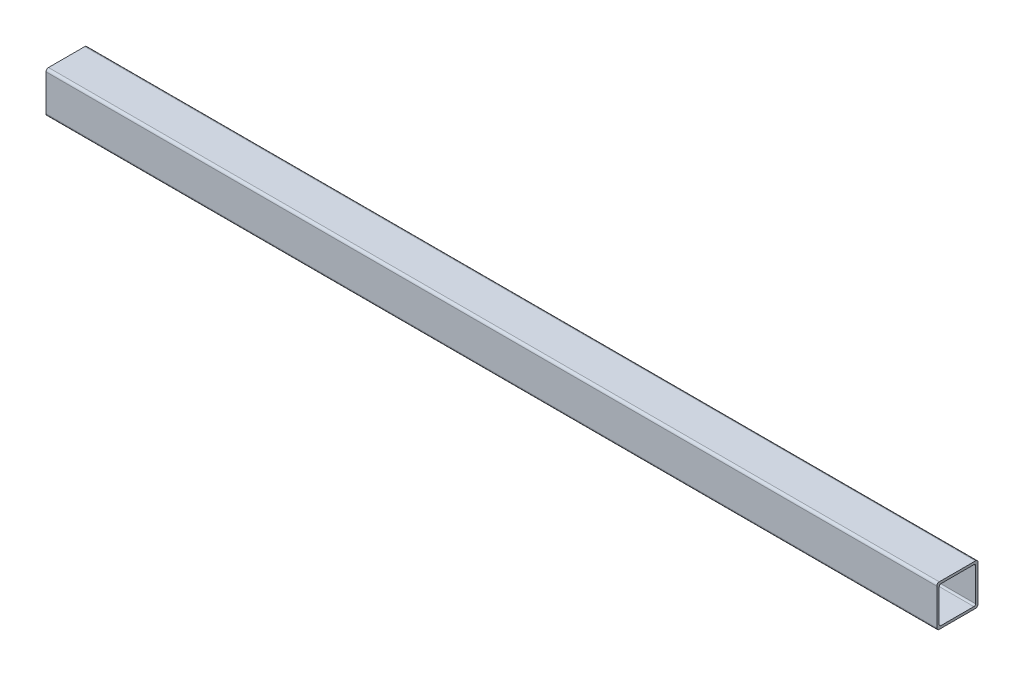
ISO-10303-21;
HEADER;
FILE_DESCRIPTION(('STEP AP214'),'2;1');
FILE_NAME('part.step','',(''),(''),'','','');
FILE_SCHEMA(('AUTOMOTIVE_DESIGN { 1 0 10303 214 1 1 1 1 }'));
ENDSEC;
DATA;
#1=APPLICATION_CONTEXT('core data for automotive mechanical design processes');
#2=APPLICATION_PROTOCOL_DEFINITION('international standard','automotive_design',2000,#1);
#3=PRODUCT_CONTEXT('',#1,'mechanical');
#4=PRODUCT('Part','Part','',(#3));
#5=PRODUCT_RELATED_PRODUCT_CATEGORY('part','',(#4));
#6=PRODUCT_DEFINITION_FORMATION('','',#4);
#7=PRODUCT_DEFINITION_CONTEXT('part definition',#1,'design');
#8=PRODUCT_DEFINITION('design','',#6,#7);
#9=PRODUCT_DEFINITION_SHAPE('','',#8);
#10=(LENGTH_UNIT() NAMED_UNIT(*) SI_UNIT(.MILLI.,.METRE.));
#11=(NAMED_UNIT(*) PLANE_ANGLE_UNIT() SI_UNIT($,.RADIAN.));
#12=(NAMED_UNIT(*) SI_UNIT($,.STERADIAN.) SOLID_ANGLE_UNIT());
#13=UNCERTAINTY_MEASURE_WITH_UNIT(LENGTH_MEASURE(1.E-05),#10,'distance_accuracy_value','');
#14=(GEOMETRIC_REPRESENTATION_CONTEXT(3) GLOBAL_UNCERTAINTY_ASSIGNED_CONTEXT((#13)) GLOBAL_UNIT_ASSIGNED_CONTEXT((#10,
#11,#12)) REPRESENTATION_CONTEXT('',''));
#15=CARTESIAN_POINT('',(0.,0.,0.));
#16=DIRECTION('',(0.,0.,1.));
#17=DIRECTION('',(1.,0.,0.));
#18=AXIS2_PLACEMENT_3D('',#15,#16,#17);
#19=CARTESIAN_POINT('',(-1150.71067811867,-50.,47.));
#20=DIRECTION('',(0.,-1.,0.));
#21=DIRECTION('',(0.,0.,-1.));
#22=AXIS2_PLACEMENT_3D('',#19,#20,#21);
#23=PLANE('',#22);
#24=DIRECTION('',(0.,0.,1.));
#25=VECTOR('',#24,1.);
#26=CARTESIAN_POINT('',(-1080.00000000001,-50.,47.));
#27=LINE('',#26,#25);
#28=CARTESIAN_POINT('',(-1080.00000000001,-50.,3.));
#29=VERTEX_POINT('',#28);
#30=CARTESIAN_POINT('',(-1080.00000000001,-50.,47.));
#31=VERTEX_POINT('',#30);
#32=EDGE_CURVE('E11',#29,#31,#27,.T.);
#33=ORIENTED_EDGE('',*,*,#32,.F.);
#34=DIRECTION('',(1.,0.,0.));
#35=VECTOR('',#34,1.);
#36=CARTESIAN_POINT('',(-1150.71067811867,-50.,3.));
#37=LINE('',#36,#35);
#38=CARTESIAN_POINT('',(0.,-50.,3.));
#39=VERTEX_POINT('',#38);
#40=EDGE_CURVE('E233',#29,#39,#37,.T.);
#41=ORIENTED_EDGE('',*,*,#40,.T.);
#42=DIRECTION('',(0.,0.,-1.));
#43=VECTOR('',#42,1.);
#44=CARTESIAN_POINT('',(0.,-50.,47.));
#45=LINE('',#44,#43);
#46=CARTESIAN_POINT('',(0.,-50.,47.));
#47=VERTEX_POINT('',#46);
#48=EDGE_CURVE('E199',#47,#39,#45,.T.);
#49=ORIENTED_EDGE('',*,*,#48,.F.);
#50=DIRECTION('',(1.,0.,0.));
#51=VECTOR('',#50,1.);
#52=CARTESIAN_POINT('',(-1150.71067811867,-50.,47.));
#53=LINE('',#52,#51);
#54=EDGE_CURVE('E220',#31,#47,#53,.T.);
#55=ORIENTED_EDGE('',*,*,#54,.F.);
#56=EDGE_LOOP('',(#33,#41,#49,#55));
#57=FACE_BOUND('',#56,.T.);
#58=ADVANCED_FACE('F34',(#57),#23,.T.);
#59=CARTESIAN_POINT('',(-1150.71067811867,-47.,3.00000000000001));
#60=DIRECTION('',(1.,0.,0.));
#61=DIRECTION('',(0.,0.,-1.));
#62=AXIS2_PLACEMENT_3D('',#59,#60,#61);
#63=CYLINDRICAL_SURFACE('',#62,3.);
#64=CARTESIAN_POINT('',(-1080.00000000001,-47.,3.00000000000001));
#65=DIRECTION('',(1.,0.,0.));
#66=DIRECTION('',(0.,0.,-1.));
#67=AXIS2_PLACEMENT_3D('',#64,#65,#66);
#68=CIRCLE('',#67,3.);
#69=CARTESIAN_POINT('',(-1080.00000000001,-47.,0.));
#70=VERTEX_POINT('',#69);
#71=EDGE_CURVE('E300',#70,#29,#68,.F.);
#72=ORIENTED_EDGE('',*,*,#71,.F.);
#73=DIRECTION('',(1.,0.,0.));
#74=VECTOR('',#73,1.);
#75=CARTESIAN_POINT('',(-1150.71067811867,-47.,0.));
#76=LINE('',#75,#74);
#77=CARTESIAN_POINT('',(0.,-47.,0.));
#78=VERTEX_POINT('',#77);
#79=EDGE_CURVE('E231',#70,#78,#76,.T.);
#80=ORIENTED_EDGE('',*,*,#79,.T.);
#81=CARTESIAN_POINT('',(0.,-47.,3.00000000000001));
#82=DIRECTION('',(1.,0.,0.));
#83=DIRECTION('',(0.,0.,-1.));
#84=AXIS2_PLACEMENT_3D('',#81,#82,#83);
#85=CIRCLE('',#84,3.);
#86=EDGE_CURVE('E202',#39,#78,#85,.T.);
#87=ORIENTED_EDGE('',*,*,#86,.F.);
#88=ORIENTED_EDGE('',*,*,#40,.F.);
#89=EDGE_LOOP('',(#72,#80,#87,#88));
#90=FACE_BOUND('',#89,.T.);
#91=ADVANCED_FACE('F324',(#90),#63,.T.);
#92=CARTESIAN_POINT('',(-1150.71067811867,-2.99999999999999,0.));
#93=DIRECTION('',(0.,0.,-1.));
#94=DIRECTION('',(-1.,0.,0.));
#95=AXIS2_PLACEMENT_3D('',#92,#93,#94);
#96=PLANE('',#95);
#97=DIRECTION('',(0.,-1.,0.));
#98=VECTOR('',#97,1.);
#99=CARTESIAN_POINT('',(-1080.00000000001,-2.99999999999999,0.));
#100=LINE('',#99,#98);
#101=CARTESIAN_POINT('',(-1080.00000000001,-2.99999999999999,0.));
#102=VERTEX_POINT('',#101);
#103=EDGE_CURVE('E302',#102,#70,#100,.T.);
#104=ORIENTED_EDGE('',*,*,#103,.F.);
#105=DIRECTION('',(1.,0.,0.));
#106=VECTOR('',#105,1.);
#107=CARTESIAN_POINT('',(-1150.71067811867,-2.99999999999999,0.));
#108=LINE('',#107,#106);
#109=CARTESIAN_POINT('',(0.,-2.99999999999999,0.));
#110=VERTEX_POINT('',#109);
#111=EDGE_CURVE('E229',#102,#110,#108,.T.);
#112=ORIENTED_EDGE('',*,*,#111,.T.);
#113=DIRECTION('',(0.,1.,0.));
#114=VECTOR('',#113,1.);
#115=CARTESIAN_POINT('',(0.,-2.99999999999999,0.));
#116=LINE('',#115,#114);
#117=EDGE_CURVE('E205',#78,#110,#116,.T.);
#118=ORIENTED_EDGE('',*,*,#117,.F.);
#119=ORIENTED_EDGE('',*,*,#79,.F.);
#120=EDGE_LOOP('',(#104,#112,#118,#119));
#121=FACE_BOUND('',#120,.T.);
#122=ADVANCED_FACE('F321',(#121),#96,.T.);
#123=CARTESIAN_POINT('',(-1150.71067811867,-2.99999999999999,3.00000000000001));
#124=DIRECTION('',(1.,0.,0.));
#125=DIRECTION('',(0.,0.,-1.));
#126=AXIS2_PLACEMENT_3D('',#123,#124,#125);
#127=CYLINDRICAL_SURFACE('',#126,3.00000000000001);
#128=CARTESIAN_POINT('',(-1080.00000000001,-2.99999999999999,3.00000000000001));
#129=DIRECTION('',(1.,0.,0.));
#130=DIRECTION('',(0.,0.,-1.));
#131=AXIS2_PLACEMENT_3D('',#128,#129,#130);
#132=CIRCLE('',#131,3.00000000000001);
#133=CARTESIAN_POINT('',(-1080.00000000001,0.,3.00000000000001));
#134=VERTEX_POINT('',#133);
#135=EDGE_CURVE('E304',#134,#102,#132,.F.);
#136=ORIENTED_EDGE('',*,*,#135,.F.);
#137=DIRECTION('',(1.,0.,0.));
#138=VECTOR('',#137,1.);
#139=CARTESIAN_POINT('',(-1150.71067811867,0.,3.00000000000001));
#140=LINE('',#139,#138);
#141=CARTESIAN_POINT('',(0.,0.,3.00000000000001));
#142=VERTEX_POINT('',#141);
#143=EDGE_CURVE('E227',#134,#142,#140,.T.);
#144=ORIENTED_EDGE('',*,*,#143,.T.);
#145=CARTESIAN_POINT('',(0.,-2.99999999999999,3.00000000000001));
#146=DIRECTION('',(1.,0.,0.));
#147=DIRECTION('',(0.,0.,1.));
#148=AXIS2_PLACEMENT_3D('',#145,#146,#147);
#149=CIRCLE('',#148,3.00000000000001);
#150=EDGE_CURVE('E208',#110,#142,#149,.T.);
#151=ORIENTED_EDGE('',*,*,#150,.F.);
#152=ORIENTED_EDGE('',*,*,#111,.F.);
#153=EDGE_LOOP('',(#136,#144,#151,#152));
#154=FACE_BOUND('',#153,.T.);
#155=ADVANCED_FACE('F314',(#154),#127,.T.);
#156=CARTESIAN_POINT('',(-1150.71067811867,0.,47.));
#157=DIRECTION('',(0.,1.,0.));
#158=DIRECTION('',(0.,0.,1.));
#159=AXIS2_PLACEMENT_3D('',#156,#157,#158);
#160=PLANE('',#159);
#161=DIRECTION('',(0.,0.,-1.));
#162=VECTOR('',#161,1.);
#163=CARTESIAN_POINT('',(-1080.00000000001,0.,47.));
#164=LINE('',#163,#162);
#165=CARTESIAN_POINT('',(-1080.00000000001,0.,47.));
#166=VERTEX_POINT('',#165);
#167=EDGE_CURVE('E258',#166,#134,#164,.T.);
#168=ORIENTED_EDGE('',*,*,#167,.F.);
#169=DIRECTION('',(1.,0.,0.));
#170=VECTOR('',#169,1.);
#171=CARTESIAN_POINT('',(-1150.71067811867,0.,47.));
#172=LINE('',#171,#170);
#173=CARTESIAN_POINT('',(0.,0.,47.));
#174=VERTEX_POINT('',#173);
#175=EDGE_CURVE('E225',#166,#174,#172,.T.);
#176=ORIENTED_EDGE('',*,*,#175,.T.);
#177=DIRECTION('',(0.,0.,1.));
#178=VECTOR('',#177,1.);
#179=CARTESIAN_POINT('',(0.,0.,47.));
#180=LINE('',#179,#178);
#181=EDGE_CURVE('E211',#142,#174,#180,.T.);
#182=ORIENTED_EDGE('',*,*,#181,.F.);
#183=ORIENTED_EDGE('',*,*,#143,.F.);
#184=EDGE_LOOP('',(#168,#176,#182,#183));
#185=FACE_BOUND('',#184,.T.);
#186=ADVANCED_FACE('F317',(#185),#160,.T.);
#187=CARTESIAN_POINT('',(-1150.71067811867,-2.99999999999999,47.));
#188=DIRECTION('',(1.,0.,0.));
#189=DIRECTION('',(0.,0.,-1.));
#190=AXIS2_PLACEMENT_3D('',#187,#188,#189);
#191=CYLINDRICAL_SURFACE('',#190,3.00000000000001);
#192=CARTESIAN_POINT('',(-1080.00000000001,-2.99999999999999,47.));
#193=DIRECTION('',(1.,0.,0.));
#194=DIRECTION('',(0.,0.,-1.));
#195=AXIS2_PLACEMENT_3D('',#192,#193,#194);
#196=CIRCLE('',#195,3.00000000000001);
#197=CARTESIAN_POINT('',(-1080.00000000001,-2.99999999999999,50.));
#198=VERTEX_POINT('',#197);
#199=EDGE_CURVE('E254',#198,#166,#196,.F.);
#200=ORIENTED_EDGE('',*,*,#199,.F.);
#201=DIRECTION('',(1.,0.,0.));
#202=VECTOR('',#201,1.);
#203=CARTESIAN_POINT('',(-1150.71067811867,-2.99999999999999,50.));
#204=LINE('',#203,#202);
#205=CARTESIAN_POINT('',(0.,-2.99999999999999,50.));
#206=VERTEX_POINT('',#205);
#207=EDGE_CURVE('E223',#198,#206,#204,.T.);
#208=ORIENTED_EDGE('',*,*,#207,.T.);
#209=CARTESIAN_POINT('',(0.,-2.99999999999999,47.));
#210=DIRECTION('',(1.,0.,0.));
#211=DIRECTION('',(0.,0.,-1.));
#212=AXIS2_PLACEMENT_3D('',#209,#210,#211);
#213=CIRCLE('',#212,3.00000000000001);
#214=EDGE_CURVE('E214',#174,#206,#213,.T.);
#215=ORIENTED_EDGE('',*,*,#214,.F.);
#216=ORIENTED_EDGE('',*,*,#175,.F.);
#217=EDGE_LOOP('',(#200,#208,#215,#216));
#218=FACE_BOUND('',#217,.T.);
#219=ADVANCED_FACE('F337',(#218),#191,.T.);
#220=CARTESIAN_POINT('',(-1150.71067811867,-2.99999999999999,50.));
#221=DIRECTION('',(0.,0.,1.));
#222=DIRECTION('',(1.,0.,0.));
#223=AXIS2_PLACEMENT_3D('',#220,#221,#222);
#224=PLANE('',#223);
#225=DIRECTION('',(0.,1.,0.));
#226=VECTOR('',#225,1.);
#227=CARTESIAN_POINT('',(-1080.00000000001,-2.99999999999999,50.));
#228=LINE('',#227,#226);
#229=CARTESIAN_POINT('',(-1080.00000000001,-47.,50.));
#230=VERTEX_POINT('',#229);
#231=EDGE_CURVE('E251',#230,#198,#228,.T.);
#232=ORIENTED_EDGE('',*,*,#231,.F.);
#233=DIRECTION('',(1.,0.,0.));
#234=VECTOR('',#233,1.);
#235=CARTESIAN_POINT('',(-1150.71067811867,-47.,50.));
#236=LINE('',#235,#234);
#237=CARTESIAN_POINT('',(0.,-47.,50.));
#238=VERTEX_POINT('',#237);
#239=EDGE_CURVE('E221',#230,#238,#236,.T.);
#240=ORIENTED_EDGE('',*,*,#239,.T.);
#241=DIRECTION('',(0.,-1.,0.));
#242=VECTOR('',#241,1.);
#243=CARTESIAN_POINT('',(0.,-2.99999999999999,50.));
#244=LINE('',#243,#242);
#245=EDGE_CURVE('E217',#206,#238,#244,.T.);
#246=ORIENTED_EDGE('',*,*,#245,.F.);
#247=ORIENTED_EDGE('',*,*,#207,.F.);
#248=EDGE_LOOP('',(#232,#240,#246,#247));
#249=FACE_BOUND('',#248,.T.);
#250=ADVANCED_FACE('F250',(#249),#224,.T.);
#251=CARTESIAN_POINT('',(-1150.71067811867,-47.,47.));
#252=DIRECTION('',(1.,0.,0.));
#253=DIRECTION('',(0.,0.,-1.));
#254=AXIS2_PLACEMENT_3D('',#251,#252,#253);
#255=CYLINDRICAL_SURFACE('',#254,3.);
#256=CARTESIAN_POINT('',(-1080.00000000001,-47.,47.));
#257=DIRECTION('',(1.,0.,0.));
#258=DIRECTION('',(0.,0.,-1.));
#259=AXIS2_PLACEMENT_3D('',#256,#257,#258);
#260=CIRCLE('',#259,3.);
#261=EDGE_CURVE('E240',#31,#230,#260,.F.);
#262=ORIENTED_EDGE('',*,*,#261,.F.);
#263=ORIENTED_EDGE('',*,*,#54,.T.);
#264=CARTESIAN_POINT('',(0.,-47.,47.));
#265=DIRECTION('',(1.,0.,0.));
#266=DIRECTION('',(0.,0.,-1.));
#267=AXIS2_PLACEMENT_3D('',#264,#265,#266);
#268=CIRCLE('',#267,3.);
#269=EDGE_CURVE('E186',#238,#47,#268,.T.);
#270=ORIENTED_EDGE('',*,*,#269,.F.);
#271=ORIENTED_EDGE('',*,*,#239,.F.);
#272=EDGE_LOOP('',(#262,#263,#270,#271));
#273=FACE_BOUND('',#272,.T.);
#274=ADVANCED_FACE('F36',(#273),#255,.T.);
#275=CARTESIAN_POINT('',(0.,-47.,47.));
#276=DIRECTION('',(1.,0.,0.));
#277=DIRECTION('',(0.,0.,-1.));
#278=AXIS2_PLACEMENT_3D('',#275,#276,#277);
#279=PLANE('',#278);
#280=CARTESIAN_POINT('',(0.,-45.,45.));
#281=DIRECTION('',(1.,0.,0.));
#282=DIRECTION('',(0.,0.,-1.));
#283=AXIS2_PLACEMENT_3D('',#280,#281,#282);
#284=CIRCLE('',#283,2.);
#285=CARTESIAN_POINT('',(0.,-45.,47.));
#286=VERTEX_POINT('',#285);
#287=CARTESIAN_POINT('',(0.,-47.,45.));
#288=VERTEX_POINT('',#287);
#289=EDGE_CURVE('E161',#286,#288,#284,.T.);
#290=ORIENTED_EDGE('',*,*,#289,.F.);
#291=DIRECTION('',(0.,-1.,0.));
#292=VECTOR('',#291,1.);
#293=CARTESIAN_POINT('',(0.,-4.99999999999999,47.));
#294=LINE('',#293,#292);
#295=CARTESIAN_POINT('',(0.,-4.99999999999999,47.));
#296=VERTEX_POINT('',#295);
#297=EDGE_CURVE('E181',#296,#286,#294,.T.);
#298=ORIENTED_EDGE('',*,*,#297,.F.);
#299=CARTESIAN_POINT('',(0.,-4.99999999999999,45.));
#300=DIRECTION('',(1.,0.,0.));
#301=DIRECTION('',(0.,0.,-1.));
#302=AXIS2_PLACEMENT_3D('',#299,#300,#301);
#303=CIRCLE('',#302,2.);
#304=CARTESIAN_POINT('',(0.,-2.99999999999999,45.));
#305=VERTEX_POINT('',#304);
#306=EDGE_CURVE('E178',#305,#296,#303,.T.);
#307=ORIENTED_EDGE('',*,*,#306,.F.);
#308=DIRECTION('',(0.,0.,1.));
#309=VECTOR('',#308,1.);
#310=CARTESIAN_POINT('',(0.,-2.99999999999999,45.));
#311=LINE('',#310,#309);
#312=CARTESIAN_POINT('',(0.,-2.99999999999999,5.00000000000001));
#313=VERTEX_POINT('',#312);
#314=EDGE_CURVE('E175',#313,#305,#311,.T.);
#315=ORIENTED_EDGE('',*,*,#314,.F.);
#316=CARTESIAN_POINT('',(0.,-4.99999999999999,5.00000000000001));
#317=DIRECTION('',(1.,0.,0.));
#318=DIRECTION('',(0.,0.,1.));
#319=AXIS2_PLACEMENT_3D('',#316,#317,#318);
#320=CIRCLE('',#319,2.);
#321=CARTESIAN_POINT('',(0.,-4.99999999999999,3.00000000000001));
#322=VERTEX_POINT('',#321);
#323=EDGE_CURVE('E169',#322,#313,#320,.T.);
#324=ORIENTED_EDGE('',*,*,#323,.F.);
#325=DIRECTION('',(0.,1.,0.));
#326=VECTOR('',#325,1.);
#327=CARTESIAN_POINT('',(0.,-4.99999999999999,3.00000000000001));
#328=LINE('',#327,#326);
#329=CARTESIAN_POINT('',(0.,-45.,3.00000000000001));
#330=VERTEX_POINT('',#329);
#331=EDGE_CURVE('E167',#330,#322,#328,.T.);
#332=ORIENTED_EDGE('',*,*,#331,.F.);
#333=CARTESIAN_POINT('',(0.,-45.,5.00000000000001));
#334=DIRECTION('',(1.,0.,0.));
#335=DIRECTION('',(0.,0.,-1.));
#336=AXIS2_PLACEMENT_3D('',#333,#334,#335);
#337=CIRCLE('',#336,2.);
#338=CARTESIAN_POINT('',(0.,-47.,5.00000000000001));
#339=VERTEX_POINT('',#338);
#340=EDGE_CURVE('E148',#339,#330,#337,.T.);
#341=ORIENTED_EDGE('',*,*,#340,.F.);
#342=DIRECTION('',(0.,0.,-1.));
#343=VECTOR('',#342,1.);
#344=CARTESIAN_POINT('',(0.,-47.,45.));
#345=LINE('',#344,#343);
#346=EDGE_CURVE('E155',#288,#339,#345,.T.);
#347=ORIENTED_EDGE('',*,*,#346,.F.);
#348=EDGE_LOOP('',(#290,#298,#307,#315,#324,#332,#341,#347));
#349=FACE_BOUND('',#348,.T.);
#350=ORIENTED_EDGE('',*,*,#269,.T.);
#351=ORIENTED_EDGE('',*,*,#48,.T.);
#352=ORIENTED_EDGE('',*,*,#86,.T.);
#353=ORIENTED_EDGE('',*,*,#117,.T.);
#354=ORIENTED_EDGE('',*,*,#150,.T.);
#355=ORIENTED_EDGE('',*,*,#181,.T.);
#356=ORIENTED_EDGE('',*,*,#214,.T.);
#357=ORIENTED_EDGE('',*,*,#245,.T.);
#358=EDGE_LOOP('',(#350,#351,#352,#353,#354,#355,#356,#357));
#359=FACE_BOUND('',#358,.T.);
#360=ADVANCED_FACE('F163',(#349,#359),#279,.T.);
#361=CARTESIAN_POINT('',(-1150.71067811867,-47.,45.));
#362=DIRECTION('',(0.,-1.,0.));
#363=DIRECTION('',(0.,0.,-1.));
#364=AXIS2_PLACEMENT_3D('',#361,#362,#363);
#365=PLANE('',#364);
#366=DIRECTION('',(1.,0.,0.));
#367=VECTOR('',#366,1.);
#368=CARTESIAN_POINT('',(-1150.71067811867,-47.,5.00000000000001));
#369=LINE('',#368,#367);
#370=CARTESIAN_POINT('',(-1080.00000000001,-47.,5.00000000000001));
#371=VERTEX_POINT('',#370);
#372=EDGE_CURVE('E144',#371,#339,#369,.T.);
#373=ORIENTED_EDGE('',*,*,#372,.F.);
#374=DIRECTION('',(0.,0.,1.));
#375=VECTOR('',#374,1.);
#376=CARTESIAN_POINT('',(-1080.00000000001,-47.,45.));
#377=LINE('',#376,#375);
#378=CARTESIAN_POINT('',(-1080.00000000001,-47.,45.));
#379=VERTEX_POINT('',#378);
#380=EDGE_CURVE('E38',#371,#379,#377,.T.);
#381=ORIENTED_EDGE('',*,*,#380,.T.);
#382=DIRECTION('',(1.,0.,0.));
#383=VECTOR('',#382,1.);
#384=CARTESIAN_POINT('',(-1150.71067811867,-47.,45.));
#385=LINE('',#384,#383);
#386=EDGE_CURVE('E152',#379,#288,#385,.T.);
#387=ORIENTED_EDGE('',*,*,#386,.T.);
#388=ORIENTED_EDGE('',*,*,#346,.T.);
#389=EDGE_LOOP('',(#373,#381,#387,#388));
#390=FACE_BOUND('',#389,.T.);
#391=ADVANCED_FACE('F156',(#390),#365,.F.);
#392=CARTESIAN_POINT('',(-1150.71067811867,-45.,5.00000000000001));
#393=DIRECTION('',(1.,0.,0.));
#394=DIRECTION('',(0.,0.,-1.));
#395=AXIS2_PLACEMENT_3D('',#392,#393,#394);
#396=CYLINDRICAL_SURFACE('',#395,2.);
#397=DIRECTION('',(1.,0.,0.));
#398=VECTOR('',#397,1.);
#399=CARTESIAN_POINT('',(-1150.71067811867,-45.,3.00000000000001));
#400=LINE('',#399,#398);
#401=CARTESIAN_POINT('',(-1080.00000000001,-45.,3.00000000000001));
#402=VERTEX_POINT('',#401);
#403=EDGE_CURVE('E151',#402,#330,#400,.T.);
#404=ORIENTED_EDGE('',*,*,#403,.F.);
#405=CARTESIAN_POINT('',(-1080.00000000001,-45.,5.00000000000001));
#406=DIRECTION('',(1.,0.,0.));
#407=DIRECTION('',(0.,0.,-1.));
#408=AXIS2_PLACEMENT_3D('',#405,#406,#407);
#409=CIRCLE('',#408,2.);
#410=EDGE_CURVE('E43',#402,#371,#409,.F.);
#411=ORIENTED_EDGE('',*,*,#410,.T.);
#412=ORIENTED_EDGE('',*,*,#372,.T.);
#413=ORIENTED_EDGE('',*,*,#340,.T.);
#414=EDGE_LOOP('',(#404,#411,#412,#413));
#415=FACE_BOUND('',#414,.T.);
#416=ADVANCED_FACE('F146',(#415),#396,.F.);
#417=CARTESIAN_POINT('',(-1150.71067811867,-4.99999999999999,3.00000000000001));
#418=DIRECTION('',(0.,0.,-1.));
#419=DIRECTION('',(-1.,0.,0.));
#420=AXIS2_PLACEMENT_3D('',#417,#418,#419);
#421=PLANE('',#420);
#422=DIRECTION('',(1.,0.,0.));
#423=VECTOR('',#422,1.);
#424=CARTESIAN_POINT('',(-1150.71067811867,-4.99999999999999,3.00000000000001));
#425=LINE('',#424,#423);
#426=CARTESIAN_POINT('',(-1080.00000000001,-4.99999999999999,3.00000000000001));
#427=VERTEX_POINT('',#426);
#428=EDGE_CURVE('E193',#427,#322,#425,.T.);
#429=ORIENTED_EDGE('',*,*,#428,.F.);
#430=DIRECTION('',(0.,-1.,0.));
#431=VECTOR('',#430,1.);
#432=CARTESIAN_POINT('',(-1080.00000000001,-4.99999999999999,3.00000000000001));
#433=LINE('',#432,#431);
#434=EDGE_CURVE('E290',#427,#402,#433,.T.);
#435=ORIENTED_EDGE('',*,*,#434,.T.);
#436=ORIENTED_EDGE('',*,*,#403,.T.);
#437=ORIENTED_EDGE('',*,*,#331,.T.);
#438=EDGE_LOOP('',(#429,#435,#436,#437));
#439=FACE_BOUND('',#438,.T.);
#440=ADVANCED_FACE('F289',(#439),#421,.F.);
#441=CARTESIAN_POINT('',(-1150.71067811867,-4.99999999999999,5.00000000000001));
#442=DIRECTION('',(1.,0.,0.));
#443=DIRECTION('',(0.,0.,-1.));
#444=AXIS2_PLACEMENT_3D('',#441,#442,#443);
#445=CYLINDRICAL_SURFACE('',#444,2.);
#446=DIRECTION('',(1.,0.,0.));
#447=VECTOR('',#446,1.);
#448=CARTESIAN_POINT('',(-1150.71067811867,-2.99999999999999,5.00000000000001));
#449=LINE('',#448,#447);
#450=CARTESIAN_POINT('',(-1080.00000000001,-2.99999999999999,5.00000000000001));
#451=VERTEX_POINT('',#450);
#452=EDGE_CURVE('E191',#451,#313,#449,.T.);
#453=ORIENTED_EDGE('',*,*,#452,.F.);
#454=CARTESIAN_POINT('',(-1080.00000000001,-4.99999999999999,5.00000000000001));
#455=DIRECTION('',(1.,0.,0.));
#456=DIRECTION('',(0.,0.,-1.));
#457=AXIS2_PLACEMENT_3D('',#454,#455,#456);
#458=CIRCLE('',#457,2.);
#459=EDGE_CURVE('E286',#451,#427,#458,.F.);
#460=ORIENTED_EDGE('',*,*,#459,.T.);
#461=ORIENTED_EDGE('',*,*,#428,.T.);
#462=ORIENTED_EDGE('',*,*,#323,.T.);
#463=EDGE_LOOP('',(#453,#460,#461,#462));
#464=FACE_BOUND('',#463,.T.);
#465=ADVANCED_FACE('F283',(#464),#445,.F.);
#466=CARTESIAN_POINT('',(-1150.71067811867,-2.99999999999999,45.));
#467=DIRECTION('',(0.,1.,0.));
#468=DIRECTION('',(0.,0.,1.));
#469=AXIS2_PLACEMENT_3D('',#466,#467,#468);
#470=PLANE('',#469);
#471=DIRECTION('',(1.,0.,0.));
#472=VECTOR('',#471,1.);
#473=CARTESIAN_POINT('',(-1150.71067811867,-2.99999999999999,45.));
#474=LINE('',#473,#472);
#475=CARTESIAN_POINT('',(-1080.00000000001,-2.99999999999999,45.));
#476=VERTEX_POINT('',#475);
#477=EDGE_CURVE('E189',#476,#305,#474,.T.);
#478=ORIENTED_EDGE('',*,*,#477,.F.);
#479=DIRECTION('',(0.,0.,-1.));
#480=VECTOR('',#479,1.);
#481=CARTESIAN_POINT('',(-1080.00000000001,-2.99999999999999,45.));
#482=LINE('',#481,#480);
#483=EDGE_CURVE('E293',#476,#451,#482,.T.);
#484=ORIENTED_EDGE('',*,*,#483,.T.);
#485=ORIENTED_EDGE('',*,*,#452,.T.);
#486=ORIENTED_EDGE('',*,*,#314,.T.);
#487=EDGE_LOOP('',(#478,#484,#485,#486));
#488=FACE_BOUND('',#487,.T.);
#489=ADVANCED_FACE('F280',(#488),#470,.F.);
#490=CARTESIAN_POINT('',(-1150.71067811867,-4.99999999999999,45.));
#491=DIRECTION('',(1.,0.,0.));
#492=DIRECTION('',(0.,0.,-1.));
#493=AXIS2_PLACEMENT_3D('',#490,#491,#492);
#494=CYLINDRICAL_SURFACE('',#493,2.);
#495=DIRECTION('',(1.,0.,0.));
#496=VECTOR('',#495,1.);
#497=CARTESIAN_POINT('',(-1150.71067811867,-4.99999999999999,47.));
#498=LINE('',#497,#496);
#499=CARTESIAN_POINT('',(-1080.00000000001,-4.99999999999999,47.));
#500=VERTEX_POINT('',#499);
#501=EDGE_CURVE('E187',#500,#296,#498,.T.);
#502=ORIENTED_EDGE('',*,*,#501,.F.);
#503=CARTESIAN_POINT('',(-1080.00000000001,-4.99999999999999,45.));
#504=DIRECTION('',(1.,0.,0.));
#505=DIRECTION('',(0.,0.,-1.));
#506=AXIS2_PLACEMENT_3D('',#503,#504,#505);
#507=CIRCLE('',#506,2.);
#508=EDGE_CURVE('E277',#500,#476,#507,.F.);
#509=ORIENTED_EDGE('',*,*,#508,.T.);
#510=ORIENTED_EDGE('',*,*,#477,.T.);
#511=ORIENTED_EDGE('',*,*,#306,.T.);
#512=EDGE_LOOP('',(#502,#509,#510,#511));
#513=FACE_BOUND('',#512,.T.);
#514=ADVANCED_FACE('F275',(#513),#494,.F.);
#515=CARTESIAN_POINT('',(-1150.71067811867,-4.99999999999999,47.));
#516=DIRECTION('',(0.,0.,1.));
#517=DIRECTION('',(1.,0.,0.));
#518=AXIS2_PLACEMENT_3D('',#515,#516,#517);
#519=PLANE('',#518);
#520=DIRECTION('',(1.,0.,0.));
#521=VECTOR('',#520,1.);
#522=CARTESIAN_POINT('',(-1150.71067811867,-45.,47.));
#523=LINE('',#522,#521);
#524=CARTESIAN_POINT('',(-1080.00000000001,-45.,47.));
#525=VERTEX_POINT('',#524);
#526=EDGE_CURVE('E184',#525,#286,#523,.T.);
#527=ORIENTED_EDGE('',*,*,#526,.F.);
#528=DIRECTION('',(0.,1.,0.));
#529=VECTOR('',#528,1.);
#530=CARTESIAN_POINT('',(-1080.00000000001,-4.99999999999999,47.));
#531=LINE('',#530,#529);
#532=EDGE_CURVE('E272',#525,#500,#531,.T.);
#533=ORIENTED_EDGE('',*,*,#532,.T.);
#534=ORIENTED_EDGE('',*,*,#501,.T.);
#535=ORIENTED_EDGE('',*,*,#297,.T.);
#536=EDGE_LOOP('',(#527,#533,#534,#535));
#537=FACE_BOUND('',#536,.T.);
#538=ADVANCED_FACE('F269',(#537),#519,.F.);
#539=CARTESIAN_POINT('',(-1150.71067811867,-45.,45.));
#540=DIRECTION('',(1.,0.,0.));
#541=DIRECTION('',(0.,0.,-1.));
#542=AXIS2_PLACEMENT_3D('',#539,#540,#541);
#543=CYLINDRICAL_SURFACE('',#542,2.);
#544=ORIENTED_EDGE('',*,*,#386,.F.);
#545=CARTESIAN_POINT('',(-1080.00000000001,-45.,45.));
#546=DIRECTION('',(1.,0.,0.));
#547=DIRECTION('',(0.,0.,-1.));
#548=AXIS2_PLACEMENT_3D('',#545,#546,#547);
#549=CIRCLE('',#548,2.);
#550=EDGE_CURVE('E256',#379,#525,#549,.F.);
#551=ORIENTED_EDGE('',*,*,#550,.T.);
#552=ORIENTED_EDGE('',*,*,#526,.T.);
#553=ORIENTED_EDGE('',*,*,#289,.T.);
#554=EDGE_LOOP('',(#544,#551,#552,#553));
#555=FACE_BOUND('',#554,.T.);
#556=ADVANCED_FACE('F262',(#555),#543,.F.);
#557=CARTESIAN_POINT('',(-1080.00000000001,-50.,3.));
#558=DIRECTION('',(1.,0.,0.));
#559=DIRECTION('',(0.,0.,-1.));
#560=AXIS2_PLACEMENT_3D('',#557,#558,#559);
#561=PLANE('',#560);
#562=ORIENTED_EDGE('',*,*,#261,.T.);
#563=ORIENTED_EDGE('',*,*,#231,.T.);
#564=ORIENTED_EDGE('',*,*,#199,.T.);
#565=ORIENTED_EDGE('',*,*,#167,.T.);
#566=ORIENTED_EDGE('',*,*,#135,.T.);
#567=ORIENTED_EDGE('',*,*,#103,.T.);
#568=ORIENTED_EDGE('',*,*,#71,.T.);
#569=ORIENTED_EDGE('',*,*,#32,.T.);
#570=EDGE_LOOP('',(#562,#563,#564,#565,#566,#567,#568,#569));
#571=FACE_BOUND('',#570,.T.);
#572=ORIENTED_EDGE('',*,*,#380,.F.);
#573=ORIENTED_EDGE('',*,*,#410,.F.);
#574=ORIENTED_EDGE('',*,*,#434,.F.);
#575=ORIENTED_EDGE('',*,*,#459,.F.);
#576=ORIENTED_EDGE('',*,*,#483,.F.);
#577=ORIENTED_EDGE('',*,*,#508,.F.);
#578=ORIENTED_EDGE('',*,*,#532,.F.);
#579=ORIENTED_EDGE('',*,*,#550,.F.);
#580=EDGE_LOOP('',(#572,#573,#574,#575,#576,#577,#578,#579));
#581=FACE_BOUND('',#580,.T.);
#582=ADVANCED_FACE('F307',(#571,#581),#561,.F.);
#583=CLOSED_SHELL('',(#58,#91,#122,#155,#186,#219,#250,#274,#360,#391,#416,#440,#465,#489,#514,
#538,#556,#582));
#584=MANIFOLD_SOLID_BREP('B2',#583);
#585=ADVANCED_BREP_SHAPE_REPRESENTATION('',(#18,#584),#14);
#586=SHAPE_DEFINITION_REPRESENTATION(#9,#585);
ENDSEC;
END-ISO-10303-21;
